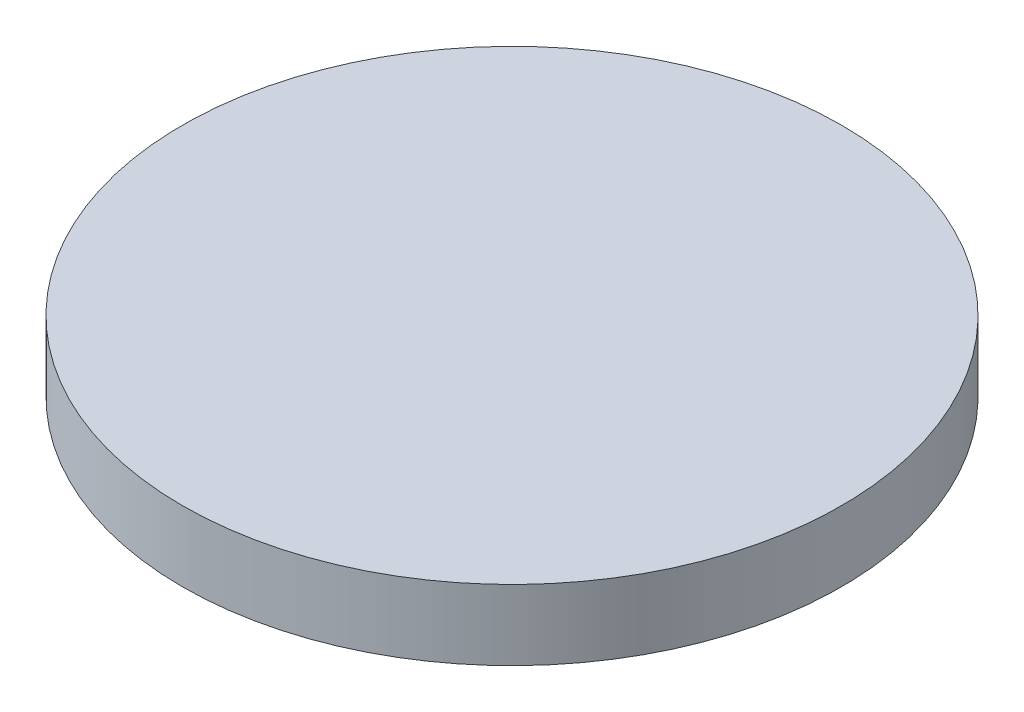
ISO-10303-21;
HEADER;
FILE_DESCRIPTION(('STEP AP214'),'2;1');
FILE_NAME('part.step','',(''),(''),'','','');
FILE_SCHEMA(('AUTOMOTIVE_DESIGN { 1 0 10303 214 1 1 1 1 }'));
ENDSEC;
DATA;
#1=APPLICATION_CONTEXT('core data for automotive mechanical design processes');
#2=APPLICATION_PROTOCOL_DEFINITION('international standard','automotive_design',2000,#1);
#3=PRODUCT_CONTEXT('',#1,'mechanical');
#4=PRODUCT('Part','Part','',(#3));
#5=PRODUCT_RELATED_PRODUCT_CATEGORY('part','',(#4));
#6=PRODUCT_DEFINITION_FORMATION('','',#4);
#7=PRODUCT_DEFINITION_CONTEXT('part definition',#1,'design');
#8=PRODUCT_DEFINITION('design','',#6,#7);
#9=PRODUCT_DEFINITION_SHAPE('','',#8);
#10=(LENGTH_UNIT() NAMED_UNIT(*) SI_UNIT(.MILLI.,.METRE.));
#11=(NAMED_UNIT(*) PLANE_ANGLE_UNIT() SI_UNIT($,.RADIAN.));
#12=(NAMED_UNIT(*) SI_UNIT($,.STERADIAN.) SOLID_ANGLE_UNIT());
#13=UNCERTAINTY_MEASURE_WITH_UNIT(LENGTH_MEASURE(1.E-05),#10,'distance_accuracy_value','');
#14=(GEOMETRIC_REPRESENTATION_CONTEXT(3) GLOBAL_UNCERTAINTY_ASSIGNED_CONTEXT((#13)) GLOBAL_UNIT_ASSIGNED_CONTEXT((#10,
#11,#12)) REPRESENTATION_CONTEXT('',''));
#15=CARTESIAN_POINT('',(0.,0.,0.));
#16=DIRECTION('',(0.,0.,1.));
#17=DIRECTION('',(1.,0.,0.));
#18=AXIS2_PLACEMENT_3D('',#15,#16,#17);
#19=CARTESIAN_POINT('',(-10.5923354528859,3.2,2.18044882235162));
#20=DIRECTION('',(0.,-1.,0.));
#21=DIRECTION('',(0.,0.,-1.));
#22=AXIS2_PLACEMENT_3D('',#19,#20,#21);
#23=CYLINDRICAL_SURFACE('',#22,15.);
#24=CARTESIAN_POINT('',(-10.5923354528859,3.2,2.18044882235162));
#25=DIRECTION('',(0.,1.,0.));
#26=DIRECTION('',(0.,0.,1.));
#27=AXIS2_PLACEMENT_3D('',#24,#25,#26);
#28=CIRCLE('',#27,15.);
#29=CARTESIAN_POINT('',(-10.5923354528859,3.2,17.1804488223516));
#30=VERTEX_POINT('',#29);
#31=EDGE_CURVE('E10',#30,#30,#28,.T.);
#32=ORIENTED_EDGE('',*,*,#31,.F.);
#33=EDGE_LOOP('',(#32));
#34=FACE_BOUND('',#33,.T.);
#35=CARTESIAN_POINT('',(-10.5923354528859,0.,2.18044882235162));
#36=DIRECTION('',(0.,1.,0.));
#37=DIRECTION('',(0.,0.,1.));
#38=AXIS2_PLACEMENT_3D('',#35,#36,#37);
#39=CIRCLE('',#38,15.);
#40=CARTESIAN_POINT('',(-10.5923354528859,0.,17.1804488223516));
#41=VERTEX_POINT('',#40);
#42=EDGE_CURVE('E34',#41,#41,#39,.T.);
#43=ORIENTED_EDGE('',*,*,#42,.T.);
#44=EDGE_LOOP('',(#43));
#45=FACE_BOUND('',#44,.T.);
#46=ADVANCED_FACE('F31',(#34,#45),#23,.T.);
#47=CARTESIAN_POINT('',(-10.5923354528859,3.2,2.18044882235162));
#48=DIRECTION('',(0.,1.,0.));
#49=DIRECTION('',(0.,0.,1.));
#50=AXIS2_PLACEMENT_3D('',#47,#48,#49);
#51=PLANE('',#50);
#52=ORIENTED_EDGE('',*,*,#31,.T.);
#53=EDGE_LOOP('',(#52));
#54=FACE_BOUND('',#53,.T.);
#55=ADVANCED_FACE('F46',(#54),#51,.T.);
#56=CARTESIAN_POINT('',(-10.5923354528859,0.,2.18044882235162));
#57=DIRECTION('',(0.,1.,0.));
#58=DIRECTION('',(0.,0.,1.));
#59=AXIS2_PLACEMENT_3D('',#56,#57,#58);
#60=PLANE('',#59);
#61=ORIENTED_EDGE('',*,*,#42,.F.);
#62=EDGE_LOOP('',(#61));
#63=FACE_BOUND('',#62,.T.);
#64=ADVANCED_FACE('F44',(#63),#60,.F.);
#65=CLOSED_SHELL('',(#46,#55,#64));
#66=MANIFOLD_SOLID_BREP('B2',#65);
#67=ADVANCED_BREP_SHAPE_REPRESENTATION('',(#18,#66),#14);
#68=SHAPE_DEFINITION_REPRESENTATION(#9,#67);
ENDSEC;
END-ISO-10303-21;
